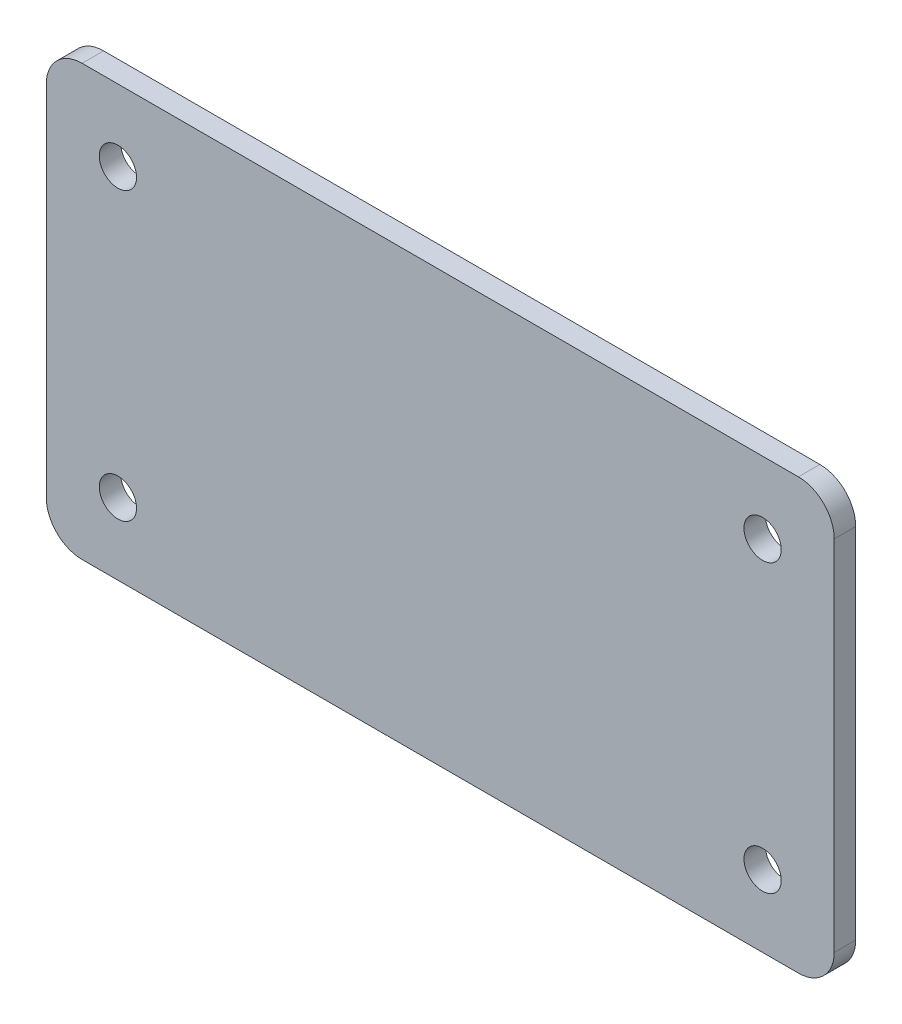
ISO-10303-21;
HEADER;
FILE_DESCRIPTION(('STEP AP214'),'2;1');
FILE_NAME('part.step','',(''),(''),'','','');
FILE_SCHEMA(('AUTOMOTIVE_DESIGN { 1 0 10303 214 1 1 1 1 }'));
ENDSEC;
DATA;
#1=APPLICATION_CONTEXT('core data for automotive mechanical design processes');
#2=APPLICATION_PROTOCOL_DEFINITION('international standard','automotive_design',2000,#1);
#3=PRODUCT_CONTEXT('',#1,'mechanical');
#4=PRODUCT('Part','Part','',(#3));
#5=PRODUCT_RELATED_PRODUCT_CATEGORY('part','',(#4));
#6=PRODUCT_DEFINITION_FORMATION('','',#4);
#7=PRODUCT_DEFINITION_CONTEXT('part definition',#1,'design');
#8=PRODUCT_DEFINITION('design','',#6,#7);
#9=PRODUCT_DEFINITION_SHAPE('','',#8);
#10=(LENGTH_UNIT() NAMED_UNIT(*) SI_UNIT(.MILLI.,.METRE.));
#11=(NAMED_UNIT(*) PLANE_ANGLE_UNIT() SI_UNIT($,.RADIAN.));
#12=(NAMED_UNIT(*) SI_UNIT($,.STERADIAN.) SOLID_ANGLE_UNIT());
#13=UNCERTAINTY_MEASURE_WITH_UNIT(LENGTH_MEASURE(1.E-05),#10,'distance_accuracy_value','');
#14=(GEOMETRIC_REPRESENTATION_CONTEXT(3) GLOBAL_UNCERTAINTY_ASSIGNED_CONTEXT((#13)) GLOBAL_UNIT_ASSIGNED_CONTEXT((#10,
#11,#12)) REPRESENTATION_CONTEXT('',''));
#15=CARTESIAN_POINT('',(0.,0.,0.));
#16=DIRECTION('',(0.,0.,1.));
#17=DIRECTION('',(1.,0.,0.));
#18=AXIS2_PLACEMENT_3D('',#15,#16,#17);
#19=CARTESIAN_POINT('',(0.,0.,3.));
#20=DIRECTION('',(0.,0.,1.));
#21=DIRECTION('',(1.,0.,0.));
#22=AXIS2_PLACEMENT_3D('',#19,#20,#21);
#23=PLANE('',#22);
#24=CARTESIAN_POINT('',(10.,-50.,3.));
#25=DIRECTION('',(0.,0.,1.));
#26=DIRECTION('',(1.,0.,0.));
#27=AXIS2_PLACEMENT_3D('',#24,#25,#26);
#28=CIRCLE('',#27,2.6);
#29=CARTESIAN_POINT('',(12.6,-50.,3.));
#30=VERTEX_POINT('',#29);
#31=EDGE_CURVE('E230',#30,#30,#28,.T.);
#32=ORIENTED_EDGE('',*,*,#31,.F.);
#33=EDGE_LOOP('',(#32));
#34=FACE_BOUND('',#33,.T.);
#35=CARTESIAN_POINT('',(10.,-10.,3.));
#36=DIRECTION('',(0.,0.,1.));
#37=DIRECTION('',(1.,0.,0.));
#38=AXIS2_PLACEMENT_3D('',#35,#36,#37);
#39=CIRCLE('',#38,2.6);
#40=CARTESIAN_POINT('',(12.6,-10.,3.));
#41=VERTEX_POINT('',#40);
#42=EDGE_CURVE('E152',#41,#41,#39,.T.);
#43=ORIENTED_EDGE('',*,*,#42,.F.);
#44=EDGE_LOOP('',(#43));
#45=FACE_BOUND('',#44,.T.);
#46=DIRECTION('',(0.,-1.,0.));
#47=VECTOR('',#46,1.);
#48=CARTESIAN_POINT('',(0.,0.,3.));
#49=LINE('',#48,#47);
#50=CARTESIAN_POINT('',(0.,-5.,3.));
#51=VERTEX_POINT('',#50);
#52=CARTESIAN_POINT('',(0.,-55.,3.));
#53=VERTEX_POINT('',#52);
#54=EDGE_CURVE('E158',#51,#53,#49,.T.);
#55=ORIENTED_EDGE('',*,*,#54,.T.);
#56=CARTESIAN_POINT('',(5.00000000000001,-55.,3.));
#57=DIRECTION('',(0.,0.,1.));
#58=DIRECTION('',(1.,0.,0.));
#59=AXIS2_PLACEMENT_3D('',#56,#57,#58);
#60=CIRCLE('',#59,5.);
#61=CARTESIAN_POINT('',(5.00000000000001,-60.,3.));
#62=VERTEX_POINT('',#61);
#63=EDGE_CURVE('E181',#53,#62,#60,.T.);
#64=ORIENTED_EDGE('',*,*,#63,.T.);
#65=DIRECTION('',(1.,0.,0.));
#66=VECTOR('',#65,1.);
#67=CARTESIAN_POINT('',(0.,-60.,3.));
#68=LINE('',#67,#66);
#69=CARTESIAN_POINT('',(105.,-60.,3.));
#70=VERTEX_POINT('',#69);
#71=EDGE_CURVE('E134',#62,#70,#68,.T.);
#72=ORIENTED_EDGE('',*,*,#71,.T.);
#73=CARTESIAN_POINT('',(105.,-55.,3.));
#74=DIRECTION('',(0.,0.,1.));
#75=DIRECTION('',(1.,0.,0.));
#76=AXIS2_PLACEMENT_3D('',#73,#74,#75);
#77=CIRCLE('',#76,5.);
#78=CARTESIAN_POINT('',(110.,-55.,3.));
#79=VERTEX_POINT('',#78);
#80=EDGE_CURVE('E175',#70,#79,#77,.T.);
#81=ORIENTED_EDGE('',*,*,#80,.T.);
#82=DIRECTION('',(0.,1.,0.));
#83=VECTOR('',#82,1.);
#84=CARTESIAN_POINT('',(110.,0.,3.));
#85=LINE('',#84,#83);
#86=CARTESIAN_POINT('',(110.,-5.,3.));
#87=VERTEX_POINT('',#86);
#88=EDGE_CURVE('E194',#79,#87,#85,.T.);
#89=ORIENTED_EDGE('',*,*,#88,.T.);
#90=CARTESIAN_POINT('',(105.,-5.,3.));
#91=DIRECTION('',(0.,0.,1.));
#92=DIRECTION('',(1.,0.,0.));
#93=AXIS2_PLACEMENT_3D('',#90,#91,#92);
#94=CIRCLE('',#93,5.);
#95=CARTESIAN_POINT('',(105.,0.,3.));
#96=VERTEX_POINT('',#95);
#97=EDGE_CURVE('E68',#87,#96,#94,.T.);
#98=ORIENTED_EDGE('',*,*,#97,.T.);
#99=DIRECTION('',(-1.,0.,0.));
#100=VECTOR('',#99,1.);
#101=CARTESIAN_POINT('',(0.,0.,3.));
#102=LINE('',#101,#100);
#103=CARTESIAN_POINT('',(5.,0.,3.));
#104=VERTEX_POINT('',#103);
#105=EDGE_CURVE('E160',#96,#104,#102,.T.);
#106=ORIENTED_EDGE('',*,*,#105,.T.);
#107=CARTESIAN_POINT('',(5.,-5.,3.));
#108=DIRECTION('',(0.,0.,1.));
#109=DIRECTION('',(1.,0.,0.));
#110=AXIS2_PLACEMENT_3D('',#107,#108,#109);
#111=CIRCLE('',#110,5.);
#112=EDGE_CURVE('E178',#104,#51,#111,.T.);
#113=ORIENTED_EDGE('',*,*,#112,.T.);
#114=EDGE_LOOP('',(#55,#64,#72,#81,#89,#98,#106,#113));
#115=FACE_BOUND('',#114,.T.);
#116=CARTESIAN_POINT('',(100.,-10.,3.));
#117=DIRECTION('',(0.,0.,1.));
#118=DIRECTION('',(1.,0.,0.));
#119=AXIS2_PLACEMENT_3D('',#116,#117,#118);
#120=CIRCLE('',#119,2.59999999999999);
#121=CARTESIAN_POINT('',(102.6,-10.,3.));
#122=VERTEX_POINT('',#121);
#123=EDGE_CURVE('E222',#122,#122,#120,.T.);
#124=ORIENTED_EDGE('',*,*,#123,.F.);
#125=EDGE_LOOP('',(#124));
#126=FACE_BOUND('',#125,.T.);
#127=CARTESIAN_POINT('',(100.,-50.,3.));
#128=DIRECTION('',(0.,0.,1.));
#129=DIRECTION('',(1.,0.,0.));
#130=AXIS2_PLACEMENT_3D('',#127,#128,#129);
#131=CIRCLE('',#130,2.59999999999999);
#132=CARTESIAN_POINT('',(102.6,-50.,3.));
#133=VERTEX_POINT('',#132);
#134=EDGE_CURVE('E238',#133,#133,#131,.T.);
#135=ORIENTED_EDGE('',*,*,#134,.F.);
#136=EDGE_LOOP('',(#135));
#137=FACE_BOUND('',#136,.T.);
#138=ADVANCED_FACE('F45',(#34,#45,#115,#126,#137),#23,.T.);
#139=CARTESIAN_POINT('',(0.,0.,0.));
#140=DIRECTION('',(0.,0.,1.));
#141=DIRECTION('',(1.,0.,0.));
#142=AXIS2_PLACEMENT_3D('',#139,#140,#141);
#143=PLANE('',#142);
#144=DIRECTION('',(1.,0.,0.));
#145=VECTOR('',#144,1.);
#146=CARTESIAN_POINT('',(0.,-60.,0.));
#147=LINE('',#146,#145);
#148=CARTESIAN_POINT('',(5.00000000000001,-60.,0.));
#149=VERTEX_POINT('',#148);
#150=CARTESIAN_POINT('',(105.,-60.,0.));
#151=VERTEX_POINT('',#150);
#152=EDGE_CURVE('E131',#149,#151,#147,.T.);
#153=ORIENTED_EDGE('',*,*,#152,.F.);
#154=CARTESIAN_POINT('',(5.00000000000001,-55.,0.));
#155=DIRECTION('',(0.,0.,1.));
#156=DIRECTION('',(1.,0.,0.));
#157=AXIS2_PLACEMENT_3D('',#154,#155,#156);
#158=CIRCLE('',#157,5.);
#159=CARTESIAN_POINT('',(0.,-55.,0.));
#160=VERTEX_POINT('',#159);
#161=EDGE_CURVE('E113',#149,#160,#158,.F.);
#162=ORIENTED_EDGE('',*,*,#161,.T.);
#163=DIRECTION('',(0.,-1.,0.));
#164=VECTOR('',#163,1.);
#165=CARTESIAN_POINT('',(0.,0.,0.));
#166=LINE('',#165,#164);
#167=CARTESIAN_POINT('',(0.,-5.,0.));
#168=VERTEX_POINT('',#167);
#169=EDGE_CURVE('E145',#168,#160,#166,.T.);
#170=ORIENTED_EDGE('',*,*,#169,.F.);
#171=CARTESIAN_POINT('',(5.,-5.,0.));
#172=DIRECTION('',(0.,0.,1.));
#173=DIRECTION('',(1.,0.,0.));
#174=AXIS2_PLACEMENT_3D('',#171,#172,#173);
#175=CIRCLE('',#174,5.);
#176=CARTESIAN_POINT('',(5.,0.,0.));
#177=VERTEX_POINT('',#176);
#178=EDGE_CURVE('E125',#168,#177,#175,.F.);
#179=ORIENTED_EDGE('',*,*,#178,.T.);
#180=DIRECTION('',(-1.,0.,0.));
#181=VECTOR('',#180,1.);
#182=CARTESIAN_POINT('',(0.,0.,0.));
#183=LINE('',#182,#181);
#184=CARTESIAN_POINT('',(105.,0.,0.));
#185=VERTEX_POINT('',#184);
#186=EDGE_CURVE('E150',#185,#177,#183,.T.);
#187=ORIENTED_EDGE('',*,*,#186,.F.);
#188=CARTESIAN_POINT('',(105.,-5.,0.));
#189=DIRECTION('',(0.,0.,1.));
#190=DIRECTION('',(1.,0.,0.));
#191=AXIS2_PLACEMENT_3D('',#188,#189,#190);
#192=CIRCLE('',#191,5.);
#193=CARTESIAN_POINT('',(110.,-5.,0.));
#194=VERTEX_POINT('',#193);
#195=EDGE_CURVE('E136',#185,#194,#192,.F.);
#196=ORIENTED_EDGE('',*,*,#195,.T.);
#197=DIRECTION('',(0.,1.,0.));
#198=VECTOR('',#197,1.);
#199=CARTESIAN_POINT('',(110.,0.,0.));
#200=LINE('',#199,#198);
#201=CARTESIAN_POINT('',(110.,-55.,0.));
#202=VERTEX_POINT('',#201);
#203=EDGE_CURVE('E144',#202,#194,#200,.T.);
#204=ORIENTED_EDGE('',*,*,#203,.F.);
#205=CARTESIAN_POINT('',(105.,-55.,0.));
#206=DIRECTION('',(0.,0.,1.));
#207=DIRECTION('',(1.,0.,0.));
#208=AXIS2_PLACEMENT_3D('',#205,#206,#207);
#209=CIRCLE('',#208,5.);
#210=EDGE_CURVE('E142',#202,#151,#209,.F.);
#211=ORIENTED_EDGE('',*,*,#210,.T.);
#212=EDGE_LOOP('',(#153,#162,#170,#179,#187,#196,#204,#211));
#213=FACE_BOUND('',#212,.T.);
#214=CARTESIAN_POINT('',(10.,-10.,0.));
#215=DIRECTION('',(0.,0.,1.));
#216=DIRECTION('',(1.,0.,0.));
#217=AXIS2_PLACEMENT_3D('',#214,#215,#216);
#218=CIRCLE('',#217,2.6);
#219=CARTESIAN_POINT('',(12.6,-10.,0.));
#220=VERTEX_POINT('',#219);
#221=EDGE_CURVE('E217',#220,#220,#218,.T.);
#222=ORIENTED_EDGE('',*,*,#221,.T.);
#223=EDGE_LOOP('',(#222));
#224=FACE_BOUND('',#223,.T.);
#225=CARTESIAN_POINT('',(100.,-10.,0.));
#226=DIRECTION('',(0.,0.,1.));
#227=DIRECTION('',(1.,0.,0.));
#228=AXIS2_PLACEMENT_3D('',#225,#226,#227);
#229=CIRCLE('',#228,2.59999999999999);
#230=CARTESIAN_POINT('',(102.6,-10.,0.));
#231=VERTEX_POINT('',#230);
#232=EDGE_CURVE('E226',#231,#231,#229,.T.);
#233=ORIENTED_EDGE('',*,*,#232,.T.);
#234=EDGE_LOOP('',(#233));
#235=FACE_BOUND('',#234,.T.);
#236=CARTESIAN_POINT('',(10.,-50.,0.));
#237=DIRECTION('',(0.,0.,1.));
#238=DIRECTION('',(1.,0.,0.));
#239=AXIS2_PLACEMENT_3D('',#236,#237,#238);
#240=CIRCLE('',#239,2.6);
#241=CARTESIAN_POINT('',(12.6,-50.,0.));
#242=VERTEX_POINT('',#241);
#243=EDGE_CURVE('E234',#242,#242,#240,.T.);
#244=ORIENTED_EDGE('',*,*,#243,.T.);
#245=EDGE_LOOP('',(#244));
#246=FACE_BOUND('',#245,.T.);
#247=CARTESIAN_POINT('',(100.,-50.,0.));
#248=DIRECTION('',(0.,0.,1.));
#249=DIRECTION('',(1.,0.,0.));
#250=AXIS2_PLACEMENT_3D('',#247,#248,#249);
#251=CIRCLE('',#250,2.59999999999999);
#252=CARTESIAN_POINT('',(102.6,-50.,0.));
#253=VERTEX_POINT('',#252);
#254=EDGE_CURVE('E242',#253,#253,#251,.T.);
#255=ORIENTED_EDGE('',*,*,#254,.T.);
#256=EDGE_LOOP('',(#255));
#257=FACE_BOUND('',#256,.T.);
#258=ADVANCED_FACE('F139',(#213,#224,#235,#246,#257),#143,.F.);
#259=CARTESIAN_POINT('',(0.,0.,3.));
#260=DIRECTION('',(1.,0.,0.));
#261=DIRECTION('',(0.,1.,0.));
#262=AXIS2_PLACEMENT_3D('',#259,#260,#261);
#263=PLANE('',#262);
#264=ORIENTED_EDGE('',*,*,#169,.T.);
#265=DIRECTION('',(0.,0.,-1.));
#266=VECTOR('',#265,1.);
#267=CARTESIAN_POINT('',(0.,-55.,3.));
#268=LINE('',#267,#266);
#269=EDGE_CURVE('E118',#160,#53,#268,.F.);
#270=ORIENTED_EDGE('',*,*,#269,.T.);
#271=ORIENTED_EDGE('',*,*,#54,.F.);
#272=DIRECTION('',(0.,0.,-1.));
#273=VECTOR('',#272,1.);
#274=CARTESIAN_POINT('',(0.,-5.,3.));
#275=LINE('',#274,#273);
#276=EDGE_CURVE('E124',#51,#168,#275,.T.);
#277=ORIENTED_EDGE('',*,*,#276,.T.);
#278=EDGE_LOOP('',(#264,#270,#271,#277));
#279=FACE_BOUND('',#278,.T.);
#280=ADVANCED_FACE('F211',(#279),#263,.F.);
#281=CARTESIAN_POINT('',(0.,-60.,3.));
#282=DIRECTION('',(0.,1.,0.));
#283=DIRECTION('',(0.,0.,1.));
#284=AXIS2_PLACEMENT_3D('',#281,#282,#283);
#285=PLANE('',#284);
#286=ORIENTED_EDGE('',*,*,#71,.F.);
#287=DIRECTION('',(0.,0.,-1.));
#288=VECTOR('',#287,1.);
#289=CARTESIAN_POINT('',(5.00000000000001,-60.,3.));
#290=LINE('',#289,#288);
#291=EDGE_CURVE('E117',#62,#149,#290,.T.);
#292=ORIENTED_EDGE('',*,*,#291,.T.);
#293=ORIENTED_EDGE('',*,*,#152,.T.);
#294=DIRECTION('',(0.,0.,-1.));
#295=VECTOR('',#294,1.);
#296=CARTESIAN_POINT('',(105.,-60.,3.));
#297=LINE('',#296,#295);
#298=EDGE_CURVE('E137',#151,#70,#297,.F.);
#299=ORIENTED_EDGE('',*,*,#298,.T.);
#300=EDGE_LOOP('',(#286,#292,#293,#299));
#301=FACE_BOUND('',#300,.T.);
#302=ADVANCED_FACE('F130',(#301),#285,.F.);
#303=CARTESIAN_POINT('',(110.,0.,3.));
#304=DIRECTION('',(-1.,0.,0.));
#305=DIRECTION('',(0.,0.,1.));
#306=AXIS2_PLACEMENT_3D('',#303,#304,#305);
#307=PLANE('',#306);
#308=ORIENTED_EDGE('',*,*,#88,.F.);
#309=DIRECTION('',(0.,0.,-1.));
#310=VECTOR('',#309,1.);
#311=CARTESIAN_POINT('',(110.,-55.,3.));
#312=LINE('',#311,#310);
#313=EDGE_CURVE('E11',#79,#202,#312,.T.);
#314=ORIENTED_EDGE('',*,*,#313,.T.);
#315=ORIENTED_EDGE('',*,*,#203,.T.);
#316=DIRECTION('',(0.,0.,-1.));
#317=VECTOR('',#316,1.);
#318=CARTESIAN_POINT('',(110.,-5.,3.));
#319=LINE('',#318,#317);
#320=EDGE_CURVE('E54',#194,#87,#319,.F.);
#321=ORIENTED_EDGE('',*,*,#320,.T.);
#322=EDGE_LOOP('',(#308,#314,#315,#321));
#323=FACE_BOUND('',#322,.T.);
#324=ADVANCED_FACE('F193',(#323),#307,.F.);
#325=CARTESIAN_POINT('',(0.,0.,3.));
#326=DIRECTION('',(0.,-1.,0.));
#327=DIRECTION('',(0.,0.,-1.));
#328=AXIS2_PLACEMENT_3D('',#325,#326,#327);
#329=PLANE('',#328);
#330=ORIENTED_EDGE('',*,*,#186,.T.);
#331=DIRECTION('',(0.,0.,-1.));
#332=VECTOR('',#331,1.);
#333=CARTESIAN_POINT('',(5.,0.,3.));
#334=LINE('',#333,#332);
#335=EDGE_CURVE('E61',#177,#104,#334,.F.);
#336=ORIENTED_EDGE('',*,*,#335,.T.);
#337=ORIENTED_EDGE('',*,*,#105,.F.);
#338=DIRECTION('',(0.,0.,-1.));
#339=VECTOR('',#338,1.);
#340=CARTESIAN_POINT('',(105.,0.,3.));
#341=LINE('',#340,#339);
#342=EDGE_CURVE('E184',#96,#185,#341,.T.);
#343=ORIENTED_EDGE('',*,*,#342,.T.);
#344=EDGE_LOOP('',(#330,#336,#337,#343));
#345=FACE_BOUND('',#344,.T.);
#346=ADVANCED_FACE('F204',(#345),#329,.F.);
#347=CARTESIAN_POINT('',(10.,-10.,3.));
#348=DIRECTION('',(0.,0.,-1.));
#349=DIRECTION('',(-1.,0.,0.));
#350=AXIS2_PLACEMENT_3D('',#347,#348,#349);
#351=CYLINDRICAL_SURFACE('',#350,2.6);
#352=ORIENTED_EDGE('',*,*,#42,.T.);
#353=EDGE_LOOP('',(#352));
#354=FACE_BOUND('',#353,.T.);
#355=ORIENTED_EDGE('',*,*,#221,.F.);
#356=EDGE_LOOP('',(#355));
#357=FACE_BOUND('',#356,.T.);
#358=ADVANCED_FACE('F264',(#354,#357),#351,.F.);
#359=CARTESIAN_POINT('',(100.,-10.,3.));
#360=DIRECTION('',(0.,0.,-1.));
#361=DIRECTION('',(-1.,0.,0.));
#362=AXIS2_PLACEMENT_3D('',#359,#360,#361);
#363=CYLINDRICAL_SURFACE('',#362,2.59999999999999);
#364=ORIENTED_EDGE('',*,*,#123,.T.);
#365=EDGE_LOOP('',(#364));
#366=FACE_BOUND('',#365,.T.);
#367=ORIENTED_EDGE('',*,*,#232,.F.);
#368=EDGE_LOOP('',(#367));
#369=FACE_BOUND('',#368,.T.);
#370=ADVANCED_FACE('F320',(#366,#369),#363,.F.);
#371=CARTESIAN_POINT('',(10.,-50.,3.));
#372=DIRECTION('',(0.,0.,-1.));
#373=DIRECTION('',(-1.,0.,0.));
#374=AXIS2_PLACEMENT_3D('',#371,#372,#373);
#375=CYLINDRICAL_SURFACE('',#374,2.6);
#376=ORIENTED_EDGE('',*,*,#31,.T.);
#377=EDGE_LOOP('',(#376));
#378=FACE_BOUND('',#377,.T.);
#379=ORIENTED_EDGE('',*,*,#243,.F.);
#380=EDGE_LOOP('',(#379));
#381=FACE_BOUND('',#380,.T.);
#382=ADVANCED_FACE('F311',(#378,#381),#375,.F.);
#383=CARTESIAN_POINT('',(100.,-50.,3.));
#384=DIRECTION('',(0.,0.,-1.));
#385=DIRECTION('',(-1.,0.,0.));
#386=AXIS2_PLACEMENT_3D('',#383,#384,#385);
#387=CYLINDRICAL_SURFACE('',#386,2.59999999999999);
#388=ORIENTED_EDGE('',*,*,#134,.T.);
#389=EDGE_LOOP('',(#388));
#390=FACE_BOUND('',#389,.T.);
#391=ORIENTED_EDGE('',*,*,#254,.F.);
#392=EDGE_LOOP('',(#391));
#393=FACE_BOUND('',#392,.T.);
#394=ADVANCED_FACE('F250',(#390,#393),#387,.F.);
#395=CARTESIAN_POINT('',(5.00000000000001,-55.,3.));
#396=DIRECTION('',(0.,0.,-1.));
#397=DIRECTION('',(-1.,0.,0.));
#398=AXIS2_PLACEMENT_3D('',#395,#396,#397);
#399=CYLINDRICAL_SURFACE('',#398,5.);
#400=ORIENTED_EDGE('',*,*,#63,.F.);
#401=ORIENTED_EDGE('',*,*,#269,.F.);
#402=ORIENTED_EDGE('',*,*,#161,.F.);
#403=ORIENTED_EDGE('',*,*,#291,.F.);
#404=EDGE_LOOP('',(#400,#401,#402,#403));
#405=FACE_BOUND('',#404,.T.);
#406=ADVANCED_FACE('F116',(#405),#399,.T.);
#407=CARTESIAN_POINT('',(5.,-5.,3.));
#408=DIRECTION('',(0.,0.,-1.));
#409=DIRECTION('',(-1.,0.,0.));
#410=AXIS2_PLACEMENT_3D('',#407,#408,#409);
#411=CYLINDRICAL_SURFACE('',#410,5.);
#412=ORIENTED_EDGE('',*,*,#112,.F.);
#413=ORIENTED_EDGE('',*,*,#335,.F.);
#414=ORIENTED_EDGE('',*,*,#178,.F.);
#415=ORIENTED_EDGE('',*,*,#276,.F.);
#416=EDGE_LOOP('',(#412,#413,#414,#415));
#417=FACE_BOUND('',#416,.T.);
#418=ADVANCED_FACE('F208',(#417),#411,.T.);
#419=CARTESIAN_POINT('',(105.,-55.,3.));
#420=DIRECTION('',(0.,0.,-1.));
#421=DIRECTION('',(-1.,0.,0.));
#422=AXIS2_PLACEMENT_3D('',#419,#420,#421);
#423=CYLINDRICAL_SURFACE('',#422,5.);
#424=ORIENTED_EDGE('',*,*,#80,.F.);
#425=ORIENTED_EDGE('',*,*,#298,.F.);
#426=ORIENTED_EDGE('',*,*,#210,.F.);
#427=ORIENTED_EDGE('',*,*,#313,.F.);
#428=EDGE_LOOP('',(#424,#425,#426,#427));
#429=FACE_BOUND('',#428,.T.);
#430=ADVANCED_FACE('F278',(#429),#423,.T.);
#431=CARTESIAN_POINT('',(105.,-5.,3.));
#432=DIRECTION('',(0.,0.,-1.));
#433=DIRECTION('',(-1.,0.,0.));
#434=AXIS2_PLACEMENT_3D('',#431,#432,#433);
#435=CYLINDRICAL_SURFACE('',#434,5.);
#436=ORIENTED_EDGE('',*,*,#97,.F.);
#437=ORIENTED_EDGE('',*,*,#320,.F.);
#438=ORIENTED_EDGE('',*,*,#195,.F.);
#439=ORIENTED_EDGE('',*,*,#342,.F.);
#440=EDGE_LOOP('',(#436,#437,#438,#439));
#441=FACE_BOUND('',#440,.T.);
#442=ADVANCED_FACE('F47',(#441),#435,.T.);
#443=CLOSED_SHELL('',(#138,#258,#280,#302,#324,#346,#358,#370,#382,#394,#406,#418,#430,#442));
#444=MANIFOLD_SOLID_BREP('B2',#443);
#445=ADVANCED_BREP_SHAPE_REPRESENTATION('',(#18,#444),#14);
#446=SHAPE_DEFINITION_REPRESENTATION(#9,#445);
ENDSEC;
END-ISO-10303-21;
